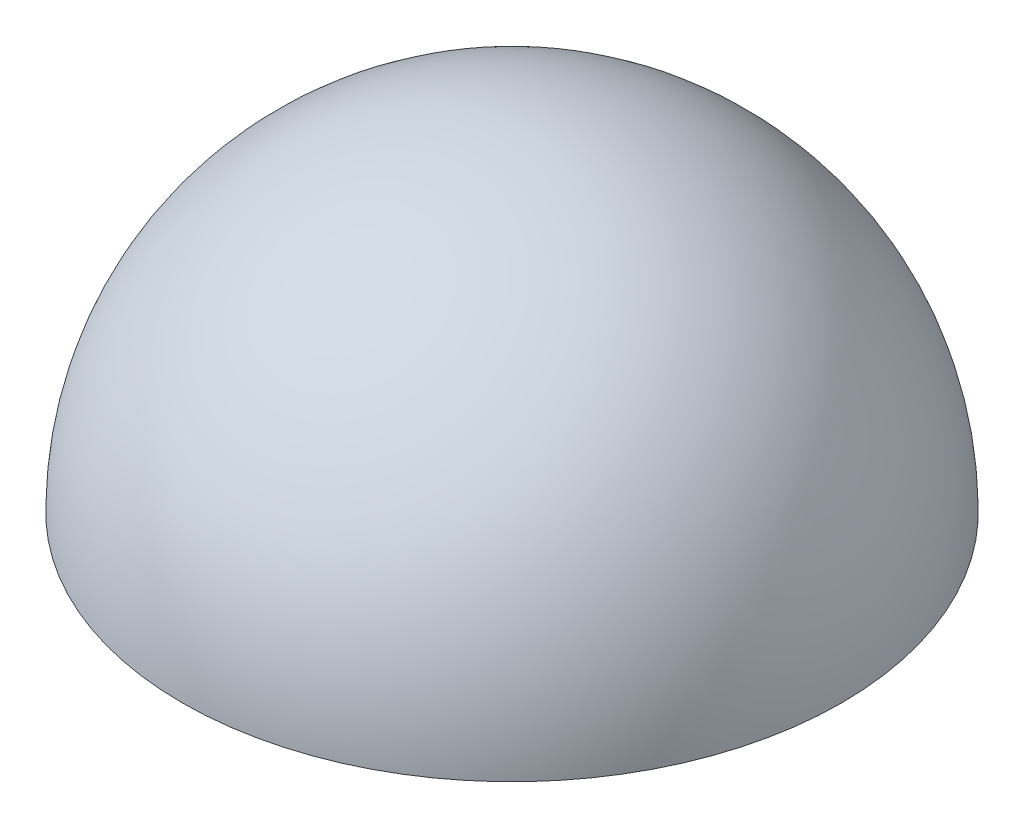
ISO-10303-21;
HEADER;
FILE_DESCRIPTION(('STEP AP214'),'2;1');
FILE_NAME('part.step','',(''),(''),'','','');
FILE_SCHEMA(('AUTOMOTIVE_DESIGN { 1 0 10303 214 1 1 1 1 }'));
ENDSEC;
DATA;
#1=APPLICATION_CONTEXT('core data for automotive mechanical design processes');
#2=APPLICATION_PROTOCOL_DEFINITION('international standard','automotive_design',2000,#1);
#3=PRODUCT_CONTEXT('',#1,'mechanical');
#4=PRODUCT('Part','Part','',(#3));
#5=PRODUCT_RELATED_PRODUCT_CATEGORY('part','',(#4));
#6=PRODUCT_DEFINITION_FORMATION('','',#4);
#7=PRODUCT_DEFINITION_CONTEXT('part definition',#1,'design');
#8=PRODUCT_DEFINITION('design','',#6,#7);
#9=PRODUCT_DEFINITION_SHAPE('','',#8);
#10=(LENGTH_UNIT() NAMED_UNIT(*) SI_UNIT(.MILLI.,.METRE.));
#11=(NAMED_UNIT(*) PLANE_ANGLE_UNIT() SI_UNIT($,.RADIAN.));
#12=(NAMED_UNIT(*) SI_UNIT($,.STERADIAN.) SOLID_ANGLE_UNIT());
#13=UNCERTAINTY_MEASURE_WITH_UNIT(LENGTH_MEASURE(1.E-05),#10,'distance_accuracy_value','');
#14=(GEOMETRIC_REPRESENTATION_CONTEXT(3) GLOBAL_UNCERTAINTY_ASSIGNED_CONTEXT((#13)) GLOBAL_UNIT_ASSIGNED_CONTEXT((#10,
#11,#12)) REPRESENTATION_CONTEXT('',''));
#15=CARTESIAN_POINT('',(0.,0.,0.));
#16=DIRECTION('',(0.,0.,1.));
#17=DIRECTION('',(1.,0.,0.));
#18=AXIS2_PLACEMENT_3D('',#15,#16,#17);
#19=CARTESIAN_POINT('',(0.,0.,0.));
#20=DIRECTION('',(0.,1.,0.));
#21=DIRECTION('',(1.,0.,0.));
#22=AXIS2_PLACEMENT_3D('',#19,#20,#21);
#23=SPHERICAL_SURFACE('',#22,25.);
#24=CARTESIAN_POINT('',(0.,0.,0.));
#25=DIRECTION('',(0.,1.,0.));
#26=DIRECTION('',(-1.,0.,0.));
#27=AXIS2_PLACEMENT_3D('',#24,#25,#26);
#28=CIRCLE('',#27,25.);
#29=CARTESIAN_POINT('',(-25.,0.,0.));
#30=VERTEX_POINT('',#29);
#31=EDGE_CURVE('E44',#30,#30,#28,.T.);
#32=ORIENTED_EDGE('',*,*,#31,.T.);
#33=EDGE_LOOP('',(#32));
#34=FACE_BOUND('',#33,.T.);
#35=ADVANCED_FACE('F37',(#34),#23,.T.);
#36=CARTESIAN_POINT('',(0.,0.,0.));
#37=DIRECTION('',(0.,1.,0.));
#38=DIRECTION('',(1.,0.,0.));
#39=AXIS2_PLACEMENT_3D('',#36,#37,#38);
#40=SPHERICAL_SURFACE('',#39,23.);
#41=CARTESIAN_POINT('',(0.,0.,0.));
#42=DIRECTION('',(0.,1.,0.));
#43=DIRECTION('',(-1.,0.,0.));
#44=AXIS2_PLACEMENT_3D('',#41,#42,#43);
#45=CIRCLE('',#44,23.);
#46=CARTESIAN_POINT('',(-23.,0.,0.));
#47=VERTEX_POINT('',#46);
#48=EDGE_CURVE('E10',#47,#47,#45,.T.);
#49=ORIENTED_EDGE('',*,*,#48,.F.);
#50=EDGE_LOOP('',(#49));
#51=FACE_BOUND('',#50,.T.);
#52=ADVANCED_FACE('F54',(#51),#40,.F.);
#53=CARTESIAN_POINT('',(23.,0.,0.));
#54=DIRECTION('',(0.,1.,0.));
#55=DIRECTION('',(-1.,0.,0.));
#56=AXIS2_PLACEMENT_3D('',#53,#54,#55);
#57=PLANE('',#56);
#58=ORIENTED_EDGE('',*,*,#31,.F.);
#59=EDGE_LOOP('',(#58));
#60=FACE_BOUND('',#59,.T.);
#61=ORIENTED_EDGE('',*,*,#48,.T.);
#62=EDGE_LOOP('',(#61));
#63=FACE_BOUND('',#62,.T.);
#64=ADVANCED_FACE('F52',(#60,#63),#57,.F.);
#65=CLOSED_SHELL('',(#35,#52,#64));
#66=MANIFOLD_SOLID_BREP('B2',#65);
#67=ADVANCED_BREP_SHAPE_REPRESENTATION('',(#18,#66),#14);
#68=SHAPE_DEFINITION_REPRESENTATION(#9,#67);
ENDSEC;
END-ISO-10303-21;
